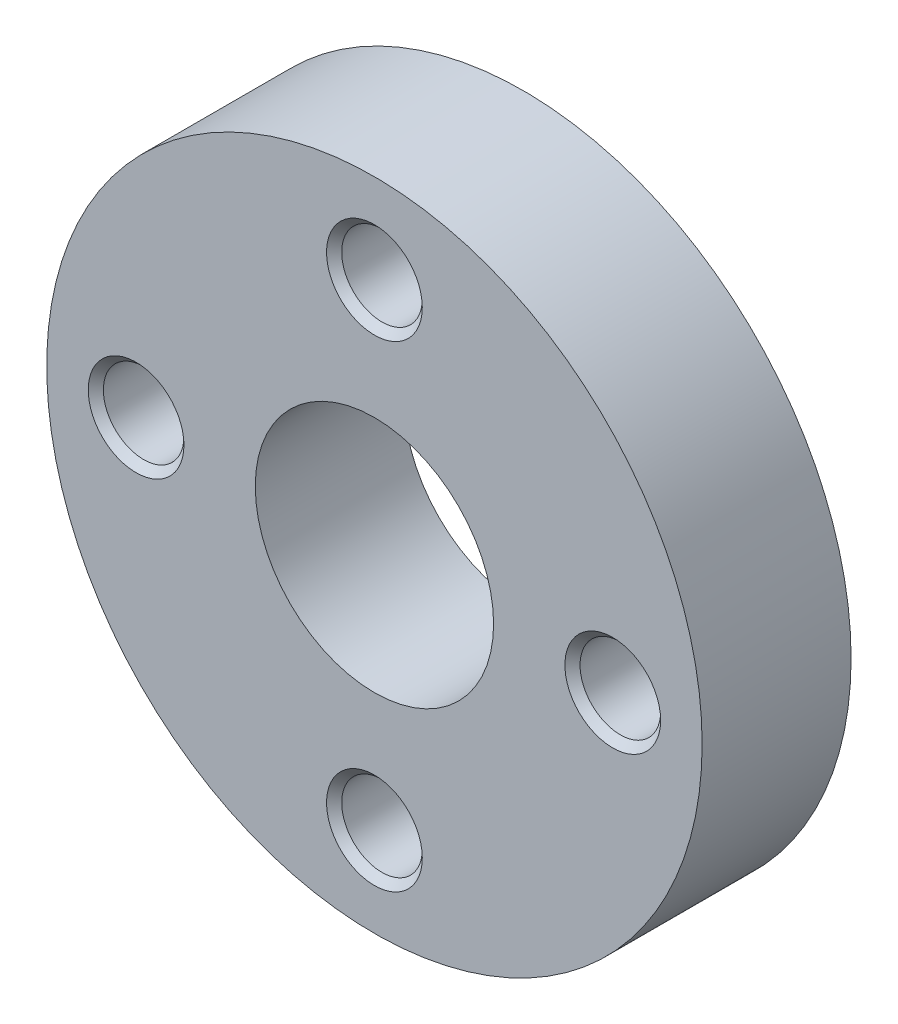
ISO-10303-21;
HEADER;
FILE_DESCRIPTION(('STEP AP214'),'2;1');
FILE_NAME('part.step','',(''),(''),'','','');
FILE_SCHEMA(('AUTOMOTIVE_DESIGN { 1 0 10303 214 1 1 1 1 }'));
ENDSEC;
DATA;
#1=APPLICATION_CONTEXT('core data for automotive mechanical design processes');
#2=APPLICATION_PROTOCOL_DEFINITION('international standard','automotive_design',2000,#1);
#3=PRODUCT_CONTEXT('',#1,'mechanical');
#4=PRODUCT('Part','Part','',(#3));
#5=PRODUCT_RELATED_PRODUCT_CATEGORY('part','',(#4));
#6=PRODUCT_DEFINITION_FORMATION('','',#4);
#7=PRODUCT_DEFINITION_CONTEXT('part definition',#1,'design');
#8=PRODUCT_DEFINITION('design','',#6,#7);
#9=PRODUCT_DEFINITION_SHAPE('','',#8);
#10=(LENGTH_UNIT() NAMED_UNIT(*) SI_UNIT(.MILLI.,.METRE.));
#11=(NAMED_UNIT(*) PLANE_ANGLE_UNIT() SI_UNIT($,.RADIAN.));
#12=(NAMED_UNIT(*) SI_UNIT($,.STERADIAN.) SOLID_ANGLE_UNIT());
#13=UNCERTAINTY_MEASURE_WITH_UNIT(LENGTH_MEASURE(1.E-05),#10,'distance_accuracy_value','');
#14=(GEOMETRIC_REPRESENTATION_CONTEXT(3) GLOBAL_UNCERTAINTY_ASSIGNED_CONTEXT((#13)) GLOBAL_UNIT_ASSIGNED_CONTEXT((#10,
#11,#12)) REPRESENTATION_CONTEXT('',''));
#15=CARTESIAN_POINT('',(0.,0.,0.));
#16=DIRECTION('',(0.,0.,1.));
#17=DIRECTION('',(1.,0.,0.));
#18=AXIS2_PLACEMENT_3D('',#15,#16,#17);
#19=CARTESIAN_POINT('',(0.,0.,-5.));
#20=DIRECTION('',(0.,0.,1.));
#21=DIRECTION('',(1.,0.,0.));
#22=AXIS2_PLACEMENT_3D('',#19,#20,#21);
#23=CYLINDRICAL_SURFACE('',#22,11.);
#24=CARTESIAN_POINT('',(0.,0.,-5.));
#25=DIRECTION('',(0.,0.,1.));
#26=DIRECTION('',(1.,0.,0.));
#27=AXIS2_PLACEMENT_3D('',#24,#25,#26);
#28=CIRCLE('',#27,11.);
#29=CARTESIAN_POINT('',(11.,0.,-5.));
#30=VERTEX_POINT('',#29);
#31=EDGE_CURVE('E89',#30,#30,#28,.T.);
#32=ORIENTED_EDGE('',*,*,#31,.T.);
#33=EDGE_LOOP('',(#32));
#34=FACE_BOUND('',#33,.T.);
#35=CARTESIAN_POINT('',(0.,0.,0.));
#36=DIRECTION('',(0.,0.,1.));
#37=DIRECTION('',(1.,0.,0.));
#38=AXIS2_PLACEMENT_3D('',#35,#36,#37);
#39=CIRCLE('',#38,11.);
#40=CARTESIAN_POINT('',(11.,0.,0.));
#41=VERTEX_POINT('',#40);
#42=EDGE_CURVE('E90',#41,#41,#39,.T.);
#43=ORIENTED_EDGE('',*,*,#42,.F.);
#44=EDGE_LOOP('',(#43));
#45=FACE_BOUND('',#44,.T.);
#46=ADVANCED_FACE('F33',(#34,#45),#23,.T.);
#47=CARTESIAN_POINT('',(0.,0.,-5.));
#48=DIRECTION('',(0.,0.,1.));
#49=DIRECTION('',(1.,0.,0.));
#50=AXIS2_PLACEMENT_3D('',#47,#48,#49);
#51=PLANE('',#50);
#52=CARTESIAN_POINT('',(0.,0.,-5.));
#53=DIRECTION('',(0.,0.,1.));
#54=DIRECTION('',(1.,0.,0.));
#55=AXIS2_PLACEMENT_3D('',#52,#53,#54);
#56=CIRCLE('',#55,4.);
#57=CARTESIAN_POINT('',(4.,0.,-5.));
#58=VERTEX_POINT('',#57);
#59=EDGE_CURVE('E93',#58,#58,#56,.T.);
#60=ORIENTED_EDGE('',*,*,#59,.T.);
#61=EDGE_LOOP('',(#60));
#62=FACE_BOUND('',#61,.T.);
#63=CARTESIAN_POINT('',(0.,-8.,-5.));
#64=DIRECTION('',(0.,0.,1.));
#65=DIRECTION('',(1.,0.,0.));
#66=AXIS2_PLACEMENT_3D('',#63,#64,#65);
#67=CIRCLE('',#66,1.60655);
#68=CARTESIAN_POINT('',(1.60655,-8.,-5.));
#69=VERTEX_POINT('',#68);
#70=EDGE_CURVE('E77',#69,#69,#67,.T.);
#71=ORIENTED_EDGE('',*,*,#70,.T.);
#72=EDGE_LOOP('',(#71));
#73=FACE_BOUND('',#72,.T.);
#74=CARTESIAN_POINT('',(-8.,0.,-5.));
#75=DIRECTION('',(0.,0.,1.));
#76=DIRECTION('',(1.,0.,0.));
#77=AXIS2_PLACEMENT_3D('',#74,#75,#76);
#78=CIRCLE('',#77,1.60655000000001);
#79=CARTESIAN_POINT('',(-6.39345,0.,-5.));
#80=VERTEX_POINT('',#79);
#81=EDGE_CURVE('E80',#80,#80,#78,.T.);
#82=ORIENTED_EDGE('',*,*,#81,.T.);
#83=EDGE_LOOP('',(#82));
#84=FACE_BOUND('',#83,.T.);
#85=CARTESIAN_POINT('',(0.,8.,-5.));
#86=DIRECTION('',(0.,0.,1.));
#87=DIRECTION('',(1.,0.,0.));
#88=AXIS2_PLACEMENT_3D('',#85,#86,#87);
#89=CIRCLE('',#88,1.60655);
#90=CARTESIAN_POINT('',(1.60655,8.,-5.));
#91=VERTEX_POINT('',#90);
#92=EDGE_CURVE('E83',#91,#91,#89,.T.);
#93=ORIENTED_EDGE('',*,*,#92,.T.);
#94=EDGE_LOOP('',(#93));
#95=FACE_BOUND('',#94,.T.);
#96=CARTESIAN_POINT('',(8.,0.,-5.));
#97=DIRECTION('',(0.,0.,1.));
#98=DIRECTION('',(1.,0.,0.));
#99=AXIS2_PLACEMENT_3D('',#96,#97,#98);
#100=CIRCLE('',#99,1.60654999999999);
#101=CARTESIAN_POINT('',(9.60655,0.,-5.));
#102=VERTEX_POINT('',#101);
#103=EDGE_CURVE('E86',#102,#102,#100,.T.);
#104=ORIENTED_EDGE('',*,*,#103,.T.);
#105=EDGE_LOOP('',(#104));
#106=FACE_BOUND('',#105,.T.);
#107=ORIENTED_EDGE('',*,*,#31,.F.);
#108=EDGE_LOOP('',(#107));
#109=FACE_BOUND('',#108,.T.);
#110=ADVANCED_FACE('F102',(#62,#73,#84,#95,#106,#109),#51,.F.);
#111=CARTESIAN_POINT('',(0.,0.,0.));
#112=DIRECTION('',(0.,0.,1.));
#113=DIRECTION('',(1.,0.,0.));
#114=AXIS2_PLACEMENT_3D('',#111,#112,#113);
#115=PLANE('',#114);
#116=CARTESIAN_POINT('',(0.,0.,0.));
#117=DIRECTION('',(0.,0.,1.));
#118=DIRECTION('',(1.,0.,0.));
#119=AXIS2_PLACEMENT_3D('',#116,#117,#118);
#120=CIRCLE('',#119,4.);
#121=CARTESIAN_POINT('',(4.,0.,0.));
#122=VERTEX_POINT('',#121);
#123=EDGE_CURVE('E96',#122,#122,#120,.T.);
#124=ORIENTED_EDGE('',*,*,#123,.F.);
#125=EDGE_LOOP('',(#124));
#126=FACE_BOUND('',#125,.T.);
#127=CARTESIAN_POINT('',(8.,0.,0.));
#128=DIRECTION('',(0.,0.,1.));
#129=DIRECTION('',(1.,0.,0.));
#130=AXIS2_PLACEMENT_3D('',#127,#128,#129);
#131=CIRCLE('',#130,1.60654999999999);
#132=CARTESIAN_POINT('',(9.60654999999999,0.,0.));
#133=VERTEX_POINT('',#132);
#134=EDGE_CURVE('E10',#133,#133,#131,.F.);
#135=ORIENTED_EDGE('',*,*,#134,.T.);
#136=EDGE_LOOP('',(#135));
#137=FACE_BOUND('',#136,.T.);
#138=CARTESIAN_POINT('',(0.,-8.,0.));
#139=DIRECTION('',(0.,0.,1.));
#140=DIRECTION('',(1.,0.,0.));
#141=AXIS2_PLACEMENT_3D('',#138,#139,#140);
#142=CIRCLE('',#141,1.60654999999999);
#143=CARTESIAN_POINT('',(1.60654999999999,-8.,0.));
#144=VERTEX_POINT('',#143);
#145=EDGE_CURVE('E40',#144,#144,#142,.F.);
#146=ORIENTED_EDGE('',*,*,#145,.T.);
#147=EDGE_LOOP('',(#146));
#148=FACE_BOUND('',#147,.T.);
#149=CARTESIAN_POINT('',(-8.,0.,0.));
#150=DIRECTION('',(0.,0.,1.));
#151=DIRECTION('',(1.,0.,0.));
#152=AXIS2_PLACEMENT_3D('',#149,#150,#151);
#153=CIRCLE('',#152,1.60654999999999);
#154=CARTESIAN_POINT('',(-6.39345000000001,0.,0.));
#155=VERTEX_POINT('',#154);
#156=EDGE_CURVE('E44',#155,#155,#153,.F.);
#157=ORIENTED_EDGE('',*,*,#156,.T.);
#158=EDGE_LOOP('',(#157));
#159=FACE_BOUND('',#158,.T.);
#160=CARTESIAN_POINT('',(0.,8.,0.));
#161=DIRECTION('',(0.,0.,1.));
#162=DIRECTION('',(1.,0.,0.));
#163=AXIS2_PLACEMENT_3D('',#160,#161,#162);
#164=CIRCLE('',#163,1.60654999999999);
#165=CARTESIAN_POINT('',(1.60654999999999,8.,0.));
#166=VERTEX_POINT('',#165);
#167=EDGE_CURVE('E48',#166,#166,#164,.F.);
#168=ORIENTED_EDGE('',*,*,#167,.T.);
#169=EDGE_LOOP('',(#168));
#170=FACE_BOUND('',#169,.T.);
#171=ORIENTED_EDGE('',*,*,#42,.T.);
#172=EDGE_LOOP('',(#171));
#173=FACE_BOUND('',#172,.T.);
#174=ADVANCED_FACE('F111',(#126,#137,#148,#159,#170,#173),#115,.T.);
#175=CARTESIAN_POINT('',(0.,-8.,0.));
#176=DIRECTION('',(0.,0.,1.));
#177=DIRECTION('',(1.,0.,0.));
#178=AXIS2_PLACEMENT_3D('',#175,#176,#177);
#179=CYLINDRICAL_SURFACE('',#178,1.35254999999999);
#180=CARTESIAN_POINT('',(0.,-8.,-4.74599999999999));
#181=DIRECTION('',(0.,0.,1.));
#182=DIRECTION('',(1.,0.,0.));
#183=AXIS2_PLACEMENT_3D('',#180,#181,#182);
#184=CIRCLE('',#183,1.35254999999999);
#185=CARTESIAN_POINT('',(1.35254999999999,-8.,-4.74599999999999));
#186=VERTEX_POINT('',#185);
#187=EDGE_CURVE('E71',#186,#186,#184,.F.);
#188=ORIENTED_EDGE('',*,*,#187,.T.);
#189=EDGE_LOOP('',(#188));
#190=FACE_BOUND('',#189,.T.);
#191=CARTESIAN_POINT('',(0.,-8.,-0.253999999999997));
#192=DIRECTION('',(0.,0.,1.));
#193=DIRECTION('',(1.,0.,0.));
#194=AXIS2_PLACEMENT_3D('',#191,#192,#193);
#195=CIRCLE('',#194,1.35254999999999);
#196=CARTESIAN_POINT('',(1.35254999999999,-8.,-0.253999999999997));
#197=VERTEX_POINT('',#196);
#198=EDGE_CURVE('E74',#197,#197,#195,.T.);
#199=ORIENTED_EDGE('',*,*,#198,.T.);
#200=EDGE_LOOP('',(#199));
#201=FACE_BOUND('',#200,.T.);
#202=ADVANCED_FACE('F113',(#190,#201),#179,.F.);
#203=CARTESIAN_POINT('',(8.,0.,0.));
#204=DIRECTION('',(0.,0.,1.));
#205=DIRECTION('',(1.,0.,0.));
#206=AXIS2_PLACEMENT_3D('',#203,#204,#205);
#207=CYLINDRICAL_SURFACE('',#206,1.35254999999999);
#208=CARTESIAN_POINT('',(8.,0.,-4.746));
#209=DIRECTION('',(0.,0.,1.));
#210=DIRECTION('',(1.,0.,0.));
#211=AXIS2_PLACEMENT_3D('',#208,#209,#210);
#212=CIRCLE('',#211,1.35254999999999);
#213=CARTESIAN_POINT('',(9.35254999999999,0.,-4.746));
#214=VERTEX_POINT('',#213);
#215=EDGE_CURVE('E53',#214,#214,#212,.F.);
#216=ORIENTED_EDGE('',*,*,#215,.T.);
#217=EDGE_LOOP('',(#216));
#218=FACE_BOUND('',#217,.T.);
#219=CARTESIAN_POINT('',(8.,0.,-0.253999999999997));
#220=DIRECTION('',(0.,0.,1.));
#221=DIRECTION('',(1.,0.,0.));
#222=AXIS2_PLACEMENT_3D('',#219,#220,#221);
#223=CIRCLE('',#222,1.35254999999999);
#224=CARTESIAN_POINT('',(9.35254999999999,0.,-0.253999999999997));
#225=VERTEX_POINT('',#224);
#226=EDGE_CURVE('E56',#225,#225,#223,.T.);
#227=ORIENTED_EDGE('',*,*,#226,.T.);
#228=EDGE_LOOP('',(#227));
#229=FACE_BOUND('',#228,.T.);
#230=ADVANCED_FACE('F166',(#218,#229),#207,.F.);
#231=CARTESIAN_POINT('',(-8.,0.,0.));
#232=DIRECTION('',(0.,0.,1.));
#233=DIRECTION('',(1.,0.,0.));
#234=AXIS2_PLACEMENT_3D('',#231,#232,#233);
#235=CYLINDRICAL_SURFACE('',#234,1.35254999999999);
#236=CARTESIAN_POINT('',(-8.,0.,-4.74599999999998));
#237=DIRECTION('',(0.,0.,1.));
#238=DIRECTION('',(1.,0.,0.));
#239=AXIS2_PLACEMENT_3D('',#236,#237,#238);
#240=CIRCLE('',#239,1.35254999999999);
#241=CARTESIAN_POINT('',(-6.64745000000001,0.,-4.74599999999998));
#242=VERTEX_POINT('',#241);
#243=EDGE_CURVE('E65',#242,#242,#240,.F.);
#244=ORIENTED_EDGE('',*,*,#243,.T.);
#245=EDGE_LOOP('',(#244));
#246=FACE_BOUND('',#245,.T.);
#247=CARTESIAN_POINT('',(-8.,0.,-0.253999999999997));
#248=DIRECTION('',(0.,0.,1.));
#249=DIRECTION('',(1.,0.,0.));
#250=AXIS2_PLACEMENT_3D('',#247,#248,#249);
#251=CIRCLE('',#250,1.35254999999999);
#252=CARTESIAN_POINT('',(-6.64745000000001,0.,-0.253999999999997));
#253=VERTEX_POINT('',#252);
#254=EDGE_CURVE('E68',#253,#253,#251,.T.);
#255=ORIENTED_EDGE('',*,*,#254,.T.);
#256=EDGE_LOOP('',(#255));
#257=FACE_BOUND('',#256,.T.);
#258=ADVANCED_FACE('F164',(#246,#257),#235,.F.);
#259=CARTESIAN_POINT('',(0.,8.,0.));
#260=DIRECTION('',(0.,0.,1.));
#261=DIRECTION('',(1.,0.,0.));
#262=AXIS2_PLACEMENT_3D('',#259,#260,#261);
#263=CYLINDRICAL_SURFACE('',#262,1.35254999999999);
#264=CARTESIAN_POINT('',(0.,8.,-4.74599999999999));
#265=DIRECTION('',(0.,0.,1.));
#266=DIRECTION('',(1.,0.,0.));
#267=AXIS2_PLACEMENT_3D('',#264,#265,#266);
#268=CIRCLE('',#267,1.35254999999999);
#269=CARTESIAN_POINT('',(1.35254999999999,8.,-4.74599999999999));
#270=VERTEX_POINT('',#269);
#271=EDGE_CURVE('E59',#270,#270,#268,.F.);
#272=ORIENTED_EDGE('',*,*,#271,.T.);
#273=EDGE_LOOP('',(#272));
#274=FACE_BOUND('',#273,.T.);
#275=CARTESIAN_POINT('',(0.,8.,-0.253999999999997));
#276=DIRECTION('',(0.,0.,1.));
#277=DIRECTION('',(1.,0.,0.));
#278=AXIS2_PLACEMENT_3D('',#275,#276,#277);
#279=CIRCLE('',#278,1.35254999999999);
#280=CARTESIAN_POINT('',(1.35254999999999,8.,-0.253999999999997));
#281=VERTEX_POINT('',#280);
#282=EDGE_CURVE('E62',#281,#281,#279,.T.);
#283=ORIENTED_EDGE('',*,*,#282,.T.);
#284=EDGE_LOOP('',(#283));
#285=FACE_BOUND('',#284,.T.);
#286=ADVANCED_FACE('F134',(#274,#285),#263,.F.);
#287=CARTESIAN_POINT('',(0.,-8.,-5.));
#288=DIRECTION('',(0.,0.,-1.));
#289=DIRECTION('',(-1.,0.,0.));
#290=AXIS2_PLACEMENT_3D('',#287,#288,#289);
#291=CONICAL_SURFACE('',#290,1.60655,0.785398163397444);
#292=ORIENTED_EDGE('',*,*,#187,.F.);
#293=EDGE_LOOP('',(#292));
#294=FACE_BOUND('',#293,.T.);
#295=ORIENTED_EDGE('',*,*,#70,.F.);
#296=EDGE_LOOP('',(#295));
#297=FACE_BOUND('',#296,.T.);
#298=ADVANCED_FACE('F130',(#294,#297),#291,.F.);
#299=CARTESIAN_POINT('',(-8.,0.,-5.));
#300=DIRECTION('',(0.,0.,-1.));
#301=DIRECTION('',(-1.,0.,0.));
#302=AXIS2_PLACEMENT_3D('',#299,#300,#301);
#303=CONICAL_SURFACE('',#302,1.60655000000001,0.785398163397441);
#304=ORIENTED_EDGE('',*,*,#243,.F.);
#305=EDGE_LOOP('',(#304));
#306=FACE_BOUND('',#305,.T.);
#307=ORIENTED_EDGE('',*,*,#81,.F.);
#308=EDGE_LOOP('',(#307));
#309=FACE_BOUND('',#308,.T.);
#310=ADVANCED_FACE('F133',(#306,#309),#303,.F.);
#311=CARTESIAN_POINT('',(0.,8.,-5.));
#312=DIRECTION('',(0.,0.,-1.));
#313=DIRECTION('',(-1.,0.,0.));
#314=AXIS2_PLACEMENT_3D('',#311,#312,#313);
#315=CONICAL_SURFACE('',#314,1.60655,0.785398163397444);
#316=ORIENTED_EDGE('',*,*,#271,.F.);
#317=EDGE_LOOP('',(#316));
#318=FACE_BOUND('',#317,.T.);
#319=ORIENTED_EDGE('',*,*,#92,.F.);
#320=EDGE_LOOP('',(#319));
#321=FACE_BOUND('',#320,.T.);
#322=ADVANCED_FACE('F138',(#318,#321),#315,.F.);
#323=CARTESIAN_POINT('',(8.,0.,-5.));
#324=DIRECTION('',(0.,0.,-1.));
#325=DIRECTION('',(-1.,0.,0.));
#326=AXIS2_PLACEMENT_3D('',#323,#324,#325);
#327=CONICAL_SURFACE('',#326,1.60654999999999,0.785398163397445);
#328=ORIENTED_EDGE('',*,*,#215,.F.);
#329=EDGE_LOOP('',(#328));
#330=FACE_BOUND('',#329,.T.);
#331=ORIENTED_EDGE('',*,*,#103,.F.);
#332=EDGE_LOOP('',(#331));
#333=FACE_BOUND('',#332,.T.);
#334=ADVANCED_FACE('F142',(#330,#333),#327,.F.);
#335=CARTESIAN_POINT('',(8.,0.,-0.253999999999997));
#336=DIRECTION('',(0.,0.,1.));
#337=DIRECTION('',(1.,0.,0.));
#338=AXIS2_PLACEMENT_3D('',#335,#336,#337);
#339=CONICAL_SURFACE('',#338,1.35254999999999,0.785398163397452);
#340=CARTESIAN_POINT('',(9.60654999999999,0.,0.));
#341=CARTESIAN_POINT('',(9.60390416666666,0.,-0.00264583333333384));
#342=CARTESIAN_POINT('',(9.60125833333333,0.,-0.00529166666666698));
#343=CARTESIAN_POINT('',(9.59596666666666,0.,-0.0105833333333332));
#344=CARTESIAN_POINT('',(9.59332083333332,0.,-0.0132291666666664));
#345=CARTESIAN_POINT('',(9.58802916666666,0.,-0.0185208333333331));
#346=CARTESIAN_POINT('',(9.58538333333333,0.,-0.0211666666666666));
#347=CARTESIAN_POINT('',(9.58009166666666,0.,-0.0264583333333332));
#348=CARTESIAN_POINT('',(9.57744583333332,0.,-0.0291041666666663));
#349=CARTESIAN_POINT('',(9.57215416666666,0.,-0.0343958333333328));
#350=CARTESIAN_POINT('',(9.56950833333333,0.,-0.0370416666666662));
#351=CARTESIAN_POINT('',(9.56421666666666,0.,-0.042333333333333));
#352=CARTESIAN_POINT('',(9.56157083333333,0.,-0.0449791666666664));
#353=CARTESIAN_POINT('',(9.55627916666666,0.,-0.0502708333333329));
#354=CARTESIAN_POINT('',(9.55363333333332,0.,-0.0529166666666659));
#355=CARTESIAN_POINT('',(9.54834166666666,0.,-0.0582083333333326));
#356=CARTESIAN_POINT('',(9.54569583333333,0.,-0.0608541666666661));
#357=CARTESIAN_POINT('',(9.54040416666666,0.,-0.0661458333333328));
#358=CARTESIAN_POINT('',(9.53775833333333,0.,-0.0687916666666658));
#359=CARTESIAN_POINT('',(9.53246666666666,0.,-0.0740833333333323));
#360=CARTESIAN_POINT('',(9.52982083333332,0.,-0.0767291666666657));
#361=CARTESIAN_POINT('',(9.52452916666666,0.,-0.0820208333333325));
#362=CARTESIAN_POINT('',(9.52188333333333,0.,-0.0846666666666659));
#363=CARTESIAN_POINT('',(9.51659166666666,0.,-0.0899583333333324));
#364=CARTESIAN_POINT('',(9.51394583333333,0.,-0.0926041666666655));
#365=CARTESIAN_POINT('',(9.50865416666666,0.,-0.0978958333333321));
#366=CARTESIAN_POINT('',(9.50600833333333,0.,-0.100541666666666));
#367=CARTESIAN_POINT('',(9.50071666666666,0.,-0.105833333333332));
#368=CARTESIAN_POINT('',(9.49807083333332,0.,-0.108479166666665));
#369=CARTESIAN_POINT('',(9.49277916666666,0.,-0.113770833333332));
#370=CARTESIAN_POINT('',(9.49013333333333,0.,-0.116416666666665));
#371=CARTESIAN_POINT('',(9.48484166666666,0.,-0.121708333333332));
#372=CARTESIAN_POINT('',(9.48219583333333,0.,-0.124354166666665));
#373=CARTESIAN_POINT('',(9.47690416666666,0.,-0.129645833333332));
#374=CARTESIAN_POINT('',(9.47425833333333,0.,-0.132291666666665));
#375=CARTESIAN_POINT('',(9.46896666666666,0.,-0.137583333333332));
#376=CARTESIAN_POINT('',(9.46632083333333,0.,-0.140229166666665));
#377=CARTESIAN_POINT('',(9.46102916666666,0.,-0.145520833333332));
#378=CARTESIAN_POINT('',(9.45838333333332,0.,-0.148166666666665));
#379=CARTESIAN_POINT('',(9.45309166666666,0.,-0.153458333333331));
#380=CARTESIAN_POINT('',(9.45044583333333,0.,-0.156104166666665));
#381=CARTESIAN_POINT('',(9.44515416666666,0.,-0.161395833333332));
#382=CARTESIAN_POINT('',(9.44250833333333,0.,-0.164041666666665));
#383=CARTESIAN_POINT('',(9.43721666666666,0.,-0.169333333333332));
#384=CARTESIAN_POINT('',(9.43457083333332,0.,-0.171979166666665));
#385=CARTESIAN_POINT('',(9.42927916666666,0.,-0.177270833333331));
#386=CARTESIAN_POINT('',(9.42663333333333,0.,-0.179916666666665));
#387=CARTESIAN_POINT('',(9.42134166666666,0.,-0.185208333333331));
#388=CARTESIAN_POINT('',(9.41869583333333,0.,-0.187854166666664));
#389=CARTESIAN_POINT('',(9.41340416666666,0.,-0.193145833333331));
#390=CARTESIAN_POINT('',(9.41075833333333,0.,-0.195791666666665));
#391=CARTESIAN_POINT('',(9.40546666666666,0.,-0.201083333333331));
#392=CARTESIAN_POINT('',(9.40282083333333,0.,-0.203729166666664));
#393=CARTESIAN_POINT('',(9.39752916666666,0.,-0.209020833333331));
#394=CARTESIAN_POINT('',(9.39488333333333,0.,-0.211666666666664));
#395=CARTESIAN_POINT('',(9.38959166666666,0.,-0.216958333333331));
#396=CARTESIAN_POINT('',(9.38694583333333,0.,-0.219604166666664));
#397=CARTESIAN_POINT('',(9.38165416666666,0.,-0.224895833333331));
#398=CARTESIAN_POINT('',(9.37900833333333,0.,-0.227541666666664));
#399=CARTESIAN_POINT('',(9.37371666666666,0.,-0.232833333333331));
#400=CARTESIAN_POINT('',(9.37107083333333,0.,-0.235479166666664));
#401=CARTESIAN_POINT('',(9.36577916666666,0.,-0.240770833333331));
#402=CARTESIAN_POINT('',(9.36313333333332,0.,-0.243416666666664));
#403=CARTESIAN_POINT('',(9.35784166666666,0.,-0.24870833333333));
#404=CARTESIAN_POINT('',(9.35519583333332,0.,-0.251354166666663));
#405=CARTESIAN_POINT('',(9.35254999999999,0.,-0.253999999999997));
#406=B_SPLINE_CURVE_WITH_KNOTS('',3,(#340,#341,#342,#343,#344,#345,#346,#347,#348,#349,#350,
#351,#352,#353,#354,#355,#356,#357,#358,#359,#360,#361,#362,#363,#364,#365,#366,#367,#368,#369,
#370,#371,#372,#373,#374,#375,#376,#377,#378,#379,#380,#381,#382,#383,#384,#385,#386,#387,#388,
#389,#390,#391,#392,#393,#394,#395,#396,#397,#398,#399,#400,#401,#402,#403,#404,#405),
.UNSPECIFIED.,.F.,.F.,(4,2,2,2,2,2,2,2,2,2,2,2,2,2,2,2,2,2,2,2,2,2,2,2,2,2,2,2,2,2,2,2,4),(0.,
0.0112253201513359,0.0224506403026729,0.0336759604540088,0.0449012806053459,0.0561266007566817,
0.0673519209080176,0.0785772410593547,0.0898025612106905,0.101027881362028,0.112253201513363,
0.123478521664699,0.134703841816036,0.145929161967372,0.157154482118709,0.168379802270045,
0.179605122421381,0.190830442572718,0.202055762724054,0.213281082875391,0.224506403026727,
0.235731723178063,0.2469570433294,0.258182363480736,0.269407683632073,0.280633003783409,
0.291858323934746,0.303083644086082,0.314308964237417,0.325534284388754,0.33675960454009,
0.347984924691427,0.359210244842763),.UNSPECIFIED.);
#407=EDGE_CURVE('BSEAM146',#133,#225,#406,.T.);
#408=ORIENTED_EDGE('',*,*,#134,.F.);
#409=ORIENTED_EDGE('',*,*,#226,.F.);
#410=ORIENTED_EDGE('',*,*,#407,.T.);
#411=ORIENTED_EDGE('',*,*,#407,.F.);
#412=EDGE_LOOP('',(#408,#410,#409,#411));
#413=FACE_BOUND('',#412,.T.);
#414=ADVANCED_FACE('F146',(#413),#339,.F.);
#415=CARTESIAN_POINT('',(0.,-8.,-0.253999999999997));
#416=DIRECTION('',(0.,0.,1.));
#417=DIRECTION('',(1.,0.,0.));
#418=AXIS2_PLACEMENT_3D('',#415,#416,#417);
#419=CONICAL_SURFACE('',#418,1.35254999999999,0.785398163397452);
#420=ORIENTED_EDGE('',*,*,#145,.F.);
#421=EDGE_LOOP('',(#420));
#422=FACE_BOUND('',#421,.T.);
#423=ORIENTED_EDGE('',*,*,#198,.F.);
#424=EDGE_LOOP('',(#423));
#425=FACE_BOUND('',#424,.T.);
#426=ADVANCED_FACE('F150',(#422,#425),#419,.F.);
#427=CARTESIAN_POINT('',(-8.,0.,-0.253999999999997));
#428=DIRECTION('',(0.,0.,1.));
#429=DIRECTION('',(1.,0.,0.));
#430=AXIS2_PLACEMENT_3D('',#427,#428,#429);
#431=CONICAL_SURFACE('',#430,1.35254999999999,0.785398163397452);
#432=ORIENTED_EDGE('',*,*,#156,.F.);
#433=EDGE_LOOP('',(#432));
#434=FACE_BOUND('',#433,.T.);
#435=ORIENTED_EDGE('',*,*,#254,.F.);
#436=EDGE_LOOP('',(#435));
#437=FACE_BOUND('',#436,.T.);
#438=ADVANCED_FACE('F153',(#434,#437),#431,.F.);
#439=CARTESIAN_POINT('',(0.,8.,-0.253999999999997));
#440=DIRECTION('',(0.,0.,1.));
#441=DIRECTION('',(1.,0.,0.));
#442=AXIS2_PLACEMENT_3D('',#439,#440,#441);
#443=CONICAL_SURFACE('',#442,1.35254999999999,0.785398163397452);
#444=ORIENTED_EDGE('',*,*,#167,.F.);
#445=EDGE_LOOP('',(#444));
#446=FACE_BOUND('',#445,.T.);
#447=ORIENTED_EDGE('',*,*,#282,.F.);
#448=EDGE_LOOP('',(#447));
#449=FACE_BOUND('',#448,.T.);
#450=ADVANCED_FACE('F35',(#446,#449),#443,.F.);
#451=CARTESIAN_POINT('',(0.,0.,-5.));
#452=DIRECTION('',(0.,0.,1.));
#453=DIRECTION('',(1.,0.,0.));
#454=AXIS2_PLACEMENT_3D('',#451,#452,#453);
#455=CYLINDRICAL_SURFACE('',#454,4.);
#456=ORIENTED_EDGE('',*,*,#59,.F.);
#457=EDGE_LOOP('',(#456));
#458=FACE_BOUND('',#457,.T.);
#459=ORIENTED_EDGE('',*,*,#123,.T.);
#460=EDGE_LOOP('',(#459));
#461=FACE_BOUND('',#460,.T.);
#462=ADVANCED_FACE('F105',(#458,#461),#455,.F.);
#463=CLOSED_SHELL('',(#46,#110,#174,#202,#230,#258,#286,#298,#310,#322,#334,#414,#426,#438,#450,#462));
#464=MANIFOLD_SOLID_BREP('B2',#463);
#465=ADVANCED_BREP_SHAPE_REPRESENTATION('',(#18,#464),#14);
#466=SHAPE_DEFINITION_REPRESENTATION(#9,#465);
ENDSEC;
END-ISO-10303-21;
